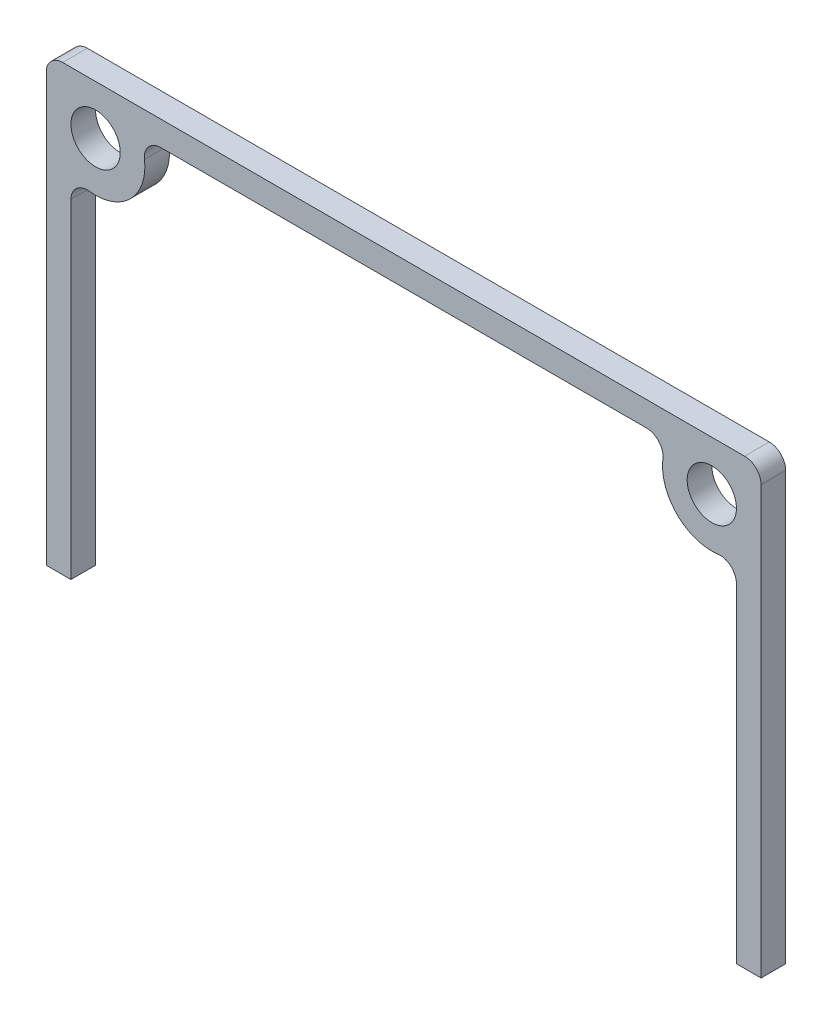
ISO-10303-21;
HEADER;
FILE_DESCRIPTION(('STEP AP214'),'2;1');
FILE_NAME('part.step','',(''),(''),'','','');
FILE_SCHEMA(('AUTOMOTIVE_DESIGN { 1 0 10303 214 1 1 1 1 }'));
ENDSEC;
DATA;
#1=APPLICATION_CONTEXT('core data for automotive mechanical design processes');
#2=APPLICATION_PROTOCOL_DEFINITION('international standard','automotive_design',2000,#1);
#3=PRODUCT_CONTEXT('',#1,'mechanical');
#4=PRODUCT('Part','Part','',(#3));
#5=PRODUCT_RELATED_PRODUCT_CATEGORY('part','',(#4));
#6=PRODUCT_DEFINITION_FORMATION('','',#4);
#7=PRODUCT_DEFINITION_CONTEXT('part definition',#1,'design');
#8=PRODUCT_DEFINITION('design','',#6,#7);
#9=PRODUCT_DEFINITION_SHAPE('','',#8);
#10=(LENGTH_UNIT() NAMED_UNIT(*) SI_UNIT(.MILLI.,.METRE.));
#11=(NAMED_UNIT(*) PLANE_ANGLE_UNIT() SI_UNIT($,.RADIAN.));
#12=(NAMED_UNIT(*) SI_UNIT($,.STERADIAN.) SOLID_ANGLE_UNIT());
#13=UNCERTAINTY_MEASURE_WITH_UNIT(LENGTH_MEASURE(1.E-05),#10,'distance_accuracy_value','');
#14=(GEOMETRIC_REPRESENTATION_CONTEXT(3) GLOBAL_UNCERTAINTY_ASSIGNED_CONTEXT((#13)) GLOBAL_UNIT_ASSIGNED_CONTEXT((#10,
#11,#12)) REPRESENTATION_CONTEXT('',''));
#15=CARTESIAN_POINT('',(0.,0.,0.));
#16=DIRECTION('',(0.,0.,1.));
#17=DIRECTION('',(1.,0.,0.));
#18=AXIS2_PLACEMENT_3D('',#15,#16,#17);
#19=CARTESIAN_POINT('',(244.475,254.39843752422,19.05));
#20=DIRECTION('',(0.,0.,1.));
#21=DIRECTION('',(1.,0.,0.));
#22=AXIS2_PLACEMENT_3D('',#19,#20,#21);
#23=PLANE('',#22);
#24=CARTESIAN_POINT('',(238.125,304.8,19.05));
#25=DIRECTION('',(0.,0.,1.));
#26=DIRECTION('',(1.,0.,0.));
#27=AXIS2_PLACEMENT_3D('',#24,#25,#26);
#28=CIRCLE('',#27,19.05);
#29=CARTESIAN_POINT('',(219.075,304.8,19.05));
#30=VERTEX_POINT('',#29);
#31=EDGE_CURVE('E183',#30,#30,#28,.T.);
#32=ORIENTED_EDGE('',*,*,#31,.F.);
#33=EDGE_LOOP('',(#32));
#34=FACE_BOUND('',#33,.T.);
#35=DIRECTION('',(1.,0.,0.));
#36=VECTOR('',#35,1.);
#37=CARTESIAN_POINT('',(276.225,0.,19.05));
#38=LINE('',#37,#36);
#39=CARTESIAN_POINT('',(257.175,0.,19.05));
#40=VERTEX_POINT('',#39);
#41=CARTESIAN_POINT('',(276.225,0.,19.05));
#42=VERTEX_POINT('',#41);
#43=EDGE_CURVE('E212',#40,#42,#38,.T.);
#44=ORIENTED_EDGE('',*,*,#43,.T.);
#45=DIRECTION('',(0.,1.,0.));
#46=VECTOR('',#45,1.);
#47=CARTESIAN_POINT('',(276.225,0.,19.05));
#48=LINE('',#47,#46);
#49=CARTESIAN_POINT('',(276.225,330.2,19.05));
#50=VERTEX_POINT('',#49);
#51=EDGE_CURVE('E115',#42,#50,#48,.T.);
#52=ORIENTED_EDGE('',*,*,#51,.T.);
#53=CARTESIAN_POINT('',(263.525,330.2,19.05));
#54=DIRECTION('',(0.,0.,1.));
#55=DIRECTION('',(-1.,0.,0.));
#56=AXIS2_PLACEMENT_3D('',#53,#54,#55);
#57=CIRCLE('',#56,12.7);
#58=CARTESIAN_POINT('',(263.525,342.9,19.05));
#59=VERTEX_POINT('',#58);
#60=EDGE_CURVE('E251',#50,#59,#57,.T.);
#61=ORIENTED_EDGE('',*,*,#60,.T.);
#62=DIRECTION('',(-1.,0.,0.));
#63=VECTOR('',#62,1.);
#64=CARTESIAN_POINT('',(263.525,342.9,19.05));
#65=LINE('',#64,#63);
#66=CARTESIAN_POINT('',(-263.525,342.9,19.05));
#67=VERTEX_POINT('',#66);
#68=EDGE_CURVE('E268',#59,#67,#65,.T.);
#69=ORIENTED_EDGE('',*,*,#68,.T.);
#70=CARTESIAN_POINT('',(-263.525,330.2,19.05));
#71=DIRECTION('',(0.,0.,1.));
#72=DIRECTION('',(1.,0.,0.));
#73=AXIS2_PLACEMENT_3D('',#70,#71,#72);
#74=CIRCLE('',#73,12.7);
#75=CARTESIAN_POINT('',(-276.225,330.2,19.05));
#76=VERTEX_POINT('',#75);
#77=EDGE_CURVE('E265',#67,#76,#74,.T.);
#78=ORIENTED_EDGE('',*,*,#77,.T.);
#79=DIRECTION('',(0.,-1.,0.));
#80=VECTOR('',#79,1.);
#81=CARTESIAN_POINT('',(-276.225,0.,19.05));
#82=LINE('',#81,#80);
#83=CARTESIAN_POINT('',(-276.225,0.,19.05));
#84=VERTEX_POINT('',#83);
#85=EDGE_CURVE('E267',#76,#84,#82,.T.);
#86=ORIENTED_EDGE('',*,*,#85,.T.);
#87=DIRECTION('',(1.,0.,0.));
#88=VECTOR('',#87,1.);
#89=CARTESIAN_POINT('',(-276.225,0.,19.05));
#90=LINE('',#89,#88);
#91=CARTESIAN_POINT('',(-257.175,0.,19.05));
#92=VERTEX_POINT('',#91);
#93=EDGE_CURVE('E270',#84,#92,#90,.T.);
#94=ORIENTED_EDGE('',*,*,#93,.T.);
#95=DIRECTION('',(0.,1.,0.));
#96=VECTOR('',#95,1.);
#97=CARTESIAN_POINT('',(-257.175,0.,19.05));
#98=LINE('',#97,#96);
#99=CARTESIAN_POINT('',(-257.175,254.39843752422,19.05));
#100=VERTEX_POINT('',#99);
#101=EDGE_CURVE('E276',#92,#100,#98,.T.);
#102=ORIENTED_EDGE('',*,*,#101,.T.);
#103=CARTESIAN_POINT('',(-244.475,254.39843752422,19.05));
#104=DIRECTION('',(0.,0.,-1.));
#105=DIRECTION('',(-1.,0.,0.));
#106=AXIS2_PLACEMENT_3D('',#103,#104,#105);
#107=CIRCLE('',#106,12.7);
#108=CARTESIAN_POINT('',(-242.8875,266.998828143165,19.05));
#109=VERTEX_POINT('',#108);
#110=EDGE_CURVE('E278',#100,#109,#107,.T.);
#111=ORIENTED_EDGE('',*,*,#110,.T.);
#112=CARTESIAN_POINT('',(-238.125,304.8,19.05));
#113=DIRECTION('',(0.,0.,1.));
#114=DIRECTION('',(1.,0.,0.));
#115=AXIS2_PLACEMENT_3D('',#112,#113,#114);
#116=CIRCLE('',#115,38.1);
#117=CARTESIAN_POINT('',(-200.323828143165,309.5625,19.05));
#118=VERTEX_POINT('',#117);
#119=EDGE_CURVE('E280',#109,#118,#116,.T.);
#120=ORIENTED_EDGE('',*,*,#119,.T.);
#121=CARTESIAN_POINT('',(-187.72343752422,311.15,19.05));
#122=DIRECTION('',(0.,0.,-1.));
#123=DIRECTION('',(1.,0.,0.));
#124=AXIS2_PLACEMENT_3D('',#121,#122,#123);
#125=CIRCLE('',#124,12.7);
#126=CARTESIAN_POINT('',(-187.72343752422,323.85,19.05));
#127=VERTEX_POINT('',#126);
#128=EDGE_CURVE('E282',#118,#127,#125,.T.);
#129=ORIENTED_EDGE('',*,*,#128,.T.);
#130=DIRECTION('',(1.,0.,0.));
#131=VECTOR('',#130,1.);
#132=CARTESIAN_POINT('',(187.72343752422,323.85,19.05));
#133=LINE('',#132,#131);
#134=CARTESIAN_POINT('',(187.72343752422,323.85,19.05));
#135=VERTEX_POINT('',#134);
#136=EDGE_CURVE('E284',#127,#135,#133,.T.);
#137=ORIENTED_EDGE('',*,*,#136,.T.);
#138=CARTESIAN_POINT('',(187.72343752422,311.15,19.05));
#139=DIRECTION('',(0.,0.,-1.));
#140=DIRECTION('',(-1.,0.,0.));
#141=AXIS2_PLACEMENT_3D('',#138,#139,#140);
#142=CIRCLE('',#141,12.7);
#143=CARTESIAN_POINT('',(200.323828143165,309.5625,19.05));
#144=VERTEX_POINT('',#143);
#145=EDGE_CURVE('E159',#135,#144,#142,.T.);
#146=ORIENTED_EDGE('',*,*,#145,.T.);
#147=CARTESIAN_POINT('',(238.125,304.8,19.05));
#148=DIRECTION('',(0.,0.,1.));
#149=DIRECTION('',(-1.,0.,0.));
#150=AXIS2_PLACEMENT_3D('',#147,#148,#149);
#151=CIRCLE('',#150,38.1);
#152=CARTESIAN_POINT('',(242.8875,266.998828143165,19.05));
#153=VERTEX_POINT('',#152);
#154=EDGE_CURVE('E152',#144,#153,#151,.T.);
#155=ORIENTED_EDGE('',*,*,#154,.T.);
#156=CARTESIAN_POINT('',(244.475,254.39843752422,19.05));
#157=DIRECTION('',(0.,0.,-1.));
#158=DIRECTION('',(1.,0.,0.));
#159=AXIS2_PLACEMENT_3D('',#156,#157,#158);
#160=CIRCLE('',#159,12.7);
#161=CARTESIAN_POINT('',(257.175,254.39843752422,19.05));
#162=VERTEX_POINT('',#161);
#163=EDGE_CURVE('E156',#153,#162,#160,.T.);
#164=ORIENTED_EDGE('',*,*,#163,.T.);
#165=DIRECTION('',(0.,-1.,0.));
#166=VECTOR('',#165,1.);
#167=CARTESIAN_POINT('',(257.175,165.1,19.05));
#168=LINE('',#167,#166);
#169=EDGE_CURVE('E50',#162,#40,#168,.T.);
#170=ORIENTED_EDGE('',*,*,#169,.T.);
#171=EDGE_LOOP('',(#44,#52,#61,#69,#78,#86,#94,#102,#111,#120,#129,#137,#146,#155,#164,#170));
#172=FACE_BOUND('',#171,.T.);
#173=CARTESIAN_POINT('',(-238.125,304.8,19.05));
#174=DIRECTION('',(0.,0.,1.));
#175=DIRECTION('',(-1.,0.,0.));
#176=AXIS2_PLACEMENT_3D('',#173,#174,#175);
#177=CIRCLE('',#176,19.05);
#178=CARTESIAN_POINT('',(-257.175,304.8,19.05));
#179=VERTEX_POINT('',#178);
#180=EDGE_CURVE('E305',#179,#179,#177,.T.);
#181=ORIENTED_EDGE('',*,*,#180,.F.);
#182=EDGE_LOOP('',(#181));
#183=FACE_BOUND('',#182,.T.);
#184=ADVANCED_FACE('F33',(#34,#172,#183),#23,.T.);
#185=CARTESIAN_POINT('',(244.475,254.39843752422,0.));
#186=DIRECTION('',(0.,0.,1.));
#187=DIRECTION('',(1.,0.,0.));
#188=AXIS2_PLACEMENT_3D('',#185,#186,#187);
#189=PLANE('',#188);
#190=DIRECTION('',(1.,0.,0.));
#191=VECTOR('',#190,1.);
#192=CARTESIAN_POINT('',(276.225,0.,0.));
#193=LINE('',#192,#191);
#194=CARTESIAN_POINT('',(257.175,0.,0.));
#195=VERTEX_POINT('',#194);
#196=CARTESIAN_POINT('',(276.225,0.,0.));
#197=VERTEX_POINT('',#196);
#198=EDGE_CURVE('E179',#195,#197,#193,.T.);
#199=ORIENTED_EDGE('',*,*,#198,.F.);
#200=DIRECTION('',(0.,-1.,0.));
#201=VECTOR('',#200,1.);
#202=CARTESIAN_POINT('',(257.175,0.,0.));
#203=LINE('',#202,#201);
#204=CARTESIAN_POINT('',(257.175,254.39843752422,0.));
#205=VERTEX_POINT('',#204);
#206=EDGE_CURVE('E103',#205,#195,#203,.T.);
#207=ORIENTED_EDGE('',*,*,#206,.F.);
#208=CARTESIAN_POINT('',(244.475,254.39843752422,0.));
#209=DIRECTION('',(0.,0.,-1.));
#210=DIRECTION('',(1.,0.,0.));
#211=AXIS2_PLACEMENT_3D('',#208,#209,#210);
#212=CIRCLE('',#211,12.7);
#213=CARTESIAN_POINT('',(242.8875,266.998828143165,0.));
#214=VERTEX_POINT('',#213);
#215=EDGE_CURVE('E209',#214,#205,#212,.T.);
#216=ORIENTED_EDGE('',*,*,#215,.F.);
#217=CARTESIAN_POINT('',(238.125,304.8,0.));
#218=DIRECTION('',(0.,0.,1.));
#219=DIRECTION('',(-1.,0.,0.));
#220=AXIS2_PLACEMENT_3D('',#217,#218,#219);
#221=CIRCLE('',#220,38.1);
#222=CARTESIAN_POINT('',(200.323828143165,309.5625,0.));
#223=VERTEX_POINT('',#222);
#224=EDGE_CURVE('E168',#223,#214,#221,.T.);
#225=ORIENTED_EDGE('',*,*,#224,.F.);
#226=CARTESIAN_POINT('',(187.72343752422,311.15,0.));
#227=DIRECTION('',(0.,0.,-1.));
#228=DIRECTION('',(-1.,0.,0.));
#229=AXIS2_PLACEMENT_3D('',#226,#227,#228);
#230=CIRCLE('',#229,12.7);
#231=CARTESIAN_POINT('',(187.72343752422,323.85,0.));
#232=VERTEX_POINT('',#231);
#233=EDGE_CURVE('E206',#232,#223,#230,.T.);
#234=ORIENTED_EDGE('',*,*,#233,.F.);
#235=DIRECTION('',(1.,0.,0.));
#236=VECTOR('',#235,1.);
#237=CARTESIAN_POINT('',(187.72343752422,323.85,0.));
#238=LINE('',#237,#236);
#239=CARTESIAN_POINT('',(-187.72343752422,323.85,0.));
#240=VERTEX_POINT('',#239);
#241=EDGE_CURVE('E204',#240,#232,#238,.T.);
#242=ORIENTED_EDGE('',*,*,#241,.F.);
#243=CARTESIAN_POINT('',(-187.72343752422,311.15,0.));
#244=DIRECTION('',(0.,0.,-1.));
#245=DIRECTION('',(1.,0.,0.));
#246=AXIS2_PLACEMENT_3D('',#243,#244,#245);
#247=CIRCLE('',#246,12.7);
#248=CARTESIAN_POINT('',(-200.323828143165,309.5625,0.));
#249=VERTEX_POINT('',#248);
#250=EDGE_CURVE('E202',#249,#240,#247,.T.);
#251=ORIENTED_EDGE('',*,*,#250,.F.);
#252=CARTESIAN_POINT('',(-238.125,304.8,0.));
#253=DIRECTION('',(0.,0.,1.));
#254=DIRECTION('',(1.,0.,0.));
#255=AXIS2_PLACEMENT_3D('',#252,#253,#254);
#256=CIRCLE('',#255,38.1);
#257=CARTESIAN_POINT('',(-242.8875,266.998828143165,0.));
#258=VERTEX_POINT('',#257);
#259=EDGE_CURVE('E200',#258,#249,#256,.T.);
#260=ORIENTED_EDGE('',*,*,#259,.F.);
#261=CARTESIAN_POINT('',(-244.475,254.39843752422,0.));
#262=DIRECTION('',(0.,0.,-1.));
#263=DIRECTION('',(-1.,0.,0.));
#264=AXIS2_PLACEMENT_3D('',#261,#262,#263);
#265=CIRCLE('',#264,12.7);
#266=CARTESIAN_POINT('',(-257.175,254.39843752422,0.));
#267=VERTEX_POINT('',#266);
#268=EDGE_CURVE('E198',#267,#258,#265,.T.);
#269=ORIENTED_EDGE('',*,*,#268,.F.);
#270=DIRECTION('',(0.,1.,0.));
#271=VECTOR('',#270,1.);
#272=CARTESIAN_POINT('',(-257.175,165.1,0.));
#273=LINE('',#272,#271);
#274=CARTESIAN_POINT('',(-257.175,0.,0.));
#275=VERTEX_POINT('',#274);
#276=EDGE_CURVE('E196',#275,#267,#273,.T.);
#277=ORIENTED_EDGE('',*,*,#276,.F.);
#278=DIRECTION('',(1.,0.,0.));
#279=VECTOR('',#278,1.);
#280=CARTESIAN_POINT('',(-276.225,0.,0.));
#281=LINE('',#280,#279);
#282=CARTESIAN_POINT('',(-276.225,0.,0.));
#283=VERTEX_POINT('',#282);
#284=EDGE_CURVE('E193',#283,#275,#281,.T.);
#285=ORIENTED_EDGE('',*,*,#284,.F.);
#286=DIRECTION('',(0.,-1.,0.));
#287=VECTOR('',#286,1.);
#288=CARTESIAN_POINT('',(-276.225,0.,0.));
#289=LINE('',#288,#287);
#290=CARTESIAN_POINT('',(-276.225,330.2,0.));
#291=VERTEX_POINT('',#290);
#292=EDGE_CURVE('E191',#291,#283,#289,.T.);
#293=ORIENTED_EDGE('',*,*,#292,.F.);
#294=CARTESIAN_POINT('',(-263.525,330.2,0.));
#295=DIRECTION('',(0.,0.,1.));
#296=DIRECTION('',(1.,0.,0.));
#297=AXIS2_PLACEMENT_3D('',#294,#295,#296);
#298=CIRCLE('',#297,12.7);
#299=CARTESIAN_POINT('',(-263.525,342.9,0.));
#300=VERTEX_POINT('',#299);
#301=EDGE_CURVE('E189',#300,#291,#298,.T.);
#302=ORIENTED_EDGE('',*,*,#301,.F.);
#303=DIRECTION('',(-1.,0.,0.));
#304=VECTOR('',#303,1.);
#305=CARTESIAN_POINT('',(263.525,342.9,0.));
#306=LINE('',#305,#304);
#307=CARTESIAN_POINT('',(263.525,342.9,0.));
#308=VERTEX_POINT('',#307);
#309=EDGE_CURVE('E187',#308,#300,#306,.T.);
#310=ORIENTED_EDGE('',*,*,#309,.F.);
#311=CARTESIAN_POINT('',(263.525,330.2,0.));
#312=DIRECTION('',(0.,0.,1.));
#313=DIRECTION('',(-1.,0.,0.));
#314=AXIS2_PLACEMENT_3D('',#311,#312,#313);
#315=CIRCLE('',#314,12.7);
#316=CARTESIAN_POINT('',(276.225,330.2,0.));
#317=VERTEX_POINT('',#316);
#318=EDGE_CURVE('E185',#317,#308,#315,.T.);
#319=ORIENTED_EDGE('',*,*,#318,.F.);
#320=DIRECTION('',(0.,1.,0.));
#321=VECTOR('',#320,1.);
#322=CARTESIAN_POINT('',(276.225,0.,0.));
#323=LINE('',#322,#321);
#324=EDGE_CURVE('E182',#197,#317,#323,.T.);
#325=ORIENTED_EDGE('',*,*,#324,.F.);
#326=EDGE_LOOP('',(#199,#207,#216,#225,#234,#242,#251,#260,#269,#277,#285,#293,#302,#310,#319,#325));
#327=FACE_BOUND('',#326,.T.);
#328=CARTESIAN_POINT('',(238.125,304.8,0.));
#329=DIRECTION('',(0.,0.,1.));
#330=DIRECTION('',(1.,0.,0.));
#331=AXIS2_PLACEMENT_3D('',#328,#329,#330);
#332=CIRCLE('',#331,19.05);
#333=CARTESIAN_POINT('',(219.075,304.8,0.));
#334=VERTEX_POINT('',#333);
#335=EDGE_CURVE('E302',#334,#334,#332,.T.);
#336=ORIENTED_EDGE('',*,*,#335,.T.);
#337=EDGE_LOOP('',(#336));
#338=FACE_BOUND('',#337,.T.);
#339=CARTESIAN_POINT('',(-238.125,304.8,0.));
#340=DIRECTION('',(0.,0.,1.));
#341=DIRECTION('',(-1.,0.,0.));
#342=AXIS2_PLACEMENT_3D('',#339,#340,#341);
#343=CIRCLE('',#342,19.05);
#344=CARTESIAN_POINT('',(-257.175,304.8,0.));
#345=VERTEX_POINT('',#344);
#346=EDGE_CURVE('E308',#345,#345,#343,.T.);
#347=ORIENTED_EDGE('',*,*,#346,.T.);
#348=EDGE_LOOP('',(#347));
#349=FACE_BOUND('',#348,.T.);
#350=ADVANCED_FACE('F253',(#327,#338,#349),#189,.F.);
#351=CARTESIAN_POINT('',(276.225,0.,19.05));
#352=DIRECTION('',(0.,1.,0.));
#353=DIRECTION('',(-1.,0.,0.));
#354=AXIS2_PLACEMENT_3D('',#351,#352,#353);
#355=PLANE('',#354);
#356=ORIENTED_EDGE('',*,*,#198,.T.);
#357=DIRECTION('',(0.,0.,-1.));
#358=VECTOR('',#357,1.);
#359=CARTESIAN_POINT('',(276.225,0.,19.05));
#360=LINE('',#359,#358);
#361=EDGE_CURVE('E11',#42,#197,#360,.T.);
#362=ORIENTED_EDGE('',*,*,#361,.F.);
#363=ORIENTED_EDGE('',*,*,#43,.F.);
#364=DIRECTION('',(0.,0.,-1.));
#365=VECTOR('',#364,1.);
#366=CARTESIAN_POINT('',(257.175,0.,19.05));
#367=LINE('',#366,#365);
#368=EDGE_CURVE('E175',#40,#195,#367,.T.);
#369=ORIENTED_EDGE('',*,*,#368,.T.);
#370=EDGE_LOOP('',(#356,#362,#363,#369));
#371=FACE_BOUND('',#370,.T.);
#372=ADVANCED_FACE('F35',(#371),#355,.F.);
#373=CARTESIAN_POINT('',(276.225,0.,19.05));
#374=DIRECTION('',(-1.,0.,0.));
#375=DIRECTION('',(0.,-1.,0.));
#376=AXIS2_PLACEMENT_3D('',#373,#374,#375);
#377=PLANE('',#376);
#378=ORIENTED_EDGE('',*,*,#324,.T.);
#379=DIRECTION('',(0.,0.,-1.));
#380=VECTOR('',#379,1.);
#381=CARTESIAN_POINT('',(276.225,330.2,19.05));
#382=LINE('',#381,#380);
#383=EDGE_CURVE('E42',#50,#317,#382,.T.);
#384=ORIENTED_EDGE('',*,*,#383,.F.);
#385=ORIENTED_EDGE('',*,*,#51,.F.);
#386=ORIENTED_EDGE('',*,*,#361,.T.);
#387=EDGE_LOOP('',(#378,#384,#385,#386));
#388=FACE_BOUND('',#387,.T.);
#389=ADVANCED_FACE('F367',(#388),#377,.F.);
#390=CARTESIAN_POINT('',(263.525,330.2,19.05));
#391=DIRECTION('',(0.,0.,-1.));
#392=DIRECTION('',(-1.,0.,0.));
#393=AXIS2_PLACEMENT_3D('',#390,#391,#392);
#394=CYLINDRICAL_SURFACE('',#393,12.7);
#395=ORIENTED_EDGE('',*,*,#318,.T.);
#396=DIRECTION('',(0.,0.,-1.));
#397=VECTOR('',#396,1.);
#398=CARTESIAN_POINT('',(263.525,342.9,19.05));
#399=LINE('',#398,#397);
#400=EDGE_CURVE('E243',#59,#308,#399,.T.);
#401=ORIENTED_EDGE('',*,*,#400,.F.);
#402=ORIENTED_EDGE('',*,*,#60,.F.);
#403=ORIENTED_EDGE('',*,*,#383,.T.);
#404=EDGE_LOOP('',(#395,#401,#402,#403));
#405=FACE_BOUND('',#404,.T.);
#406=ADVANCED_FACE('F249',(#405),#394,.T.);
#407=CARTESIAN_POINT('',(263.525,342.9,19.05));
#408=DIRECTION('',(0.,-1.,0.));
#409=DIRECTION('',(0.,0.,-1.));
#410=AXIS2_PLACEMENT_3D('',#407,#408,#409);
#411=PLANE('',#410);
#412=ORIENTED_EDGE('',*,*,#309,.T.);
#413=DIRECTION('',(0.,0.,-1.));
#414=VECTOR('',#413,1.);
#415=CARTESIAN_POINT('',(-263.525,342.9,19.05));
#416=LINE('',#415,#414);
#417=EDGE_CURVE('E240',#67,#300,#416,.T.);
#418=ORIENTED_EDGE('',*,*,#417,.F.);
#419=ORIENTED_EDGE('',*,*,#68,.F.);
#420=ORIENTED_EDGE('',*,*,#400,.T.);
#421=EDGE_LOOP('',(#412,#418,#419,#420));
#422=FACE_BOUND('',#421,.T.);
#423=ADVANCED_FACE('F259',(#422),#411,.F.);
#424=CARTESIAN_POINT('',(-263.525,330.2,19.05));
#425=DIRECTION('',(0.,0.,-1.));
#426=DIRECTION('',(-1.,0.,0.));
#427=AXIS2_PLACEMENT_3D('',#424,#425,#426);
#428=CYLINDRICAL_SURFACE('',#427,12.7);
#429=ORIENTED_EDGE('',*,*,#301,.T.);
#430=DIRECTION('',(0.,0.,-1.));
#431=VECTOR('',#430,1.);
#432=CARTESIAN_POINT('',(-276.225,330.2,19.05));
#433=LINE('',#432,#431);
#434=EDGE_CURVE('E237',#76,#291,#433,.T.);
#435=ORIENTED_EDGE('',*,*,#434,.F.);
#436=ORIENTED_EDGE('',*,*,#77,.F.);
#437=ORIENTED_EDGE('',*,*,#417,.T.);
#438=EDGE_LOOP('',(#429,#435,#436,#437));
#439=FACE_BOUND('',#438,.T.);
#440=ADVANCED_FACE('F263',(#439),#428,.T.);
#441=CARTESIAN_POINT('',(-276.225,0.,19.05));
#442=DIRECTION('',(1.,0.,0.));
#443=DIRECTION('',(0.,1.,0.));
#444=AXIS2_PLACEMENT_3D('',#441,#442,#443);
#445=PLANE('',#444);
#446=ORIENTED_EDGE('',*,*,#292,.T.);
#447=DIRECTION('',(0.,0.,-1.));
#448=VECTOR('',#447,1.);
#449=CARTESIAN_POINT('',(-276.225,0.,19.05));
#450=LINE('',#449,#448);
#451=EDGE_CURVE('E234',#84,#283,#450,.T.);
#452=ORIENTED_EDGE('',*,*,#451,.F.);
#453=ORIENTED_EDGE('',*,*,#85,.F.);
#454=ORIENTED_EDGE('',*,*,#434,.T.);
#455=EDGE_LOOP('',(#446,#452,#453,#454));
#456=FACE_BOUND('',#455,.T.);
#457=ADVANCED_FACE('F357',(#456),#445,.F.);
#458=CARTESIAN_POINT('',(-276.225,0.,19.05));
#459=DIRECTION('',(0.,1.,0.));
#460=DIRECTION('',(-1.,0.,0.));
#461=AXIS2_PLACEMENT_3D('',#458,#459,#460);
#462=PLANE('',#461);
#463=ORIENTED_EDGE('',*,*,#284,.T.);
#464=DIRECTION('',(0.,0.,-1.));
#465=VECTOR('',#464,1.);
#466=CARTESIAN_POINT('',(-257.175,0.,19.05));
#467=LINE('',#466,#465);
#468=EDGE_CURVE('E231',#92,#275,#467,.T.);
#469=ORIENTED_EDGE('',*,*,#468,.F.);
#470=ORIENTED_EDGE('',*,*,#93,.F.);
#471=ORIENTED_EDGE('',*,*,#451,.T.);
#472=EDGE_LOOP('',(#463,#469,#470,#471));
#473=FACE_BOUND('',#472,.T.);
#474=ADVANCED_FACE('F353',(#473),#462,.F.);
#475=CARTESIAN_POINT('',(-257.175,165.1,19.05));
#476=DIRECTION('',(-1.,0.,0.));
#477=DIRECTION('',(0.,0.,1.));
#478=AXIS2_PLACEMENT_3D('',#475,#476,#477);
#479=PLANE('',#478);
#480=ORIENTED_EDGE('',*,*,#276,.T.);
#481=DIRECTION('',(0.,0.,-1.));
#482=VECTOR('',#481,1.);
#483=CARTESIAN_POINT('',(-257.175,254.39843752422,19.05));
#484=LINE('',#483,#482);
#485=EDGE_CURVE('E228',#100,#267,#484,.T.);
#486=ORIENTED_EDGE('',*,*,#485,.F.);
#487=ORIENTED_EDGE('',*,*,#101,.F.);
#488=ORIENTED_EDGE('',*,*,#468,.T.);
#489=EDGE_LOOP('',(#480,#486,#487,#488));
#490=FACE_BOUND('',#489,.T.);
#491=ADVANCED_FACE('F349',(#490),#479,.F.);
#492=CARTESIAN_POINT('',(-244.475,254.39843752422,19.05));
#493=DIRECTION('',(0.,0.,-1.));
#494=DIRECTION('',(-1.,0.,0.));
#495=AXIS2_PLACEMENT_3D('',#492,#493,#494);
#496=CYLINDRICAL_SURFACE('',#495,12.7);
#497=ORIENTED_EDGE('',*,*,#268,.T.);
#498=DIRECTION('',(0.,0.,-1.));
#499=VECTOR('',#498,1.);
#500=CARTESIAN_POINT('',(-242.8875,266.998828143165,19.05));
#501=LINE('',#500,#499);
#502=EDGE_CURVE('E225',#109,#258,#501,.T.);
#503=ORIENTED_EDGE('',*,*,#502,.F.);
#504=ORIENTED_EDGE('',*,*,#110,.F.);
#505=ORIENTED_EDGE('',*,*,#485,.T.);
#506=EDGE_LOOP('',(#497,#503,#504,#505));
#507=FACE_BOUND('',#506,.T.);
#508=ADVANCED_FACE('F345',(#507),#496,.F.);
#509=CARTESIAN_POINT('',(-238.125,304.8,19.05));
#510=DIRECTION('',(0.,0.,-1.));
#511=DIRECTION('',(-1.,0.,0.));
#512=AXIS2_PLACEMENT_3D('',#509,#510,#511);
#513=CYLINDRICAL_SURFACE('',#512,38.1);
#514=ORIENTED_EDGE('',*,*,#259,.T.);
#515=DIRECTION('',(0.,0.,-1.));
#516=VECTOR('',#515,1.);
#517=CARTESIAN_POINT('',(-200.323828143165,309.5625,19.05));
#518=LINE('',#517,#516);
#519=EDGE_CURVE('E222',#118,#249,#518,.T.);
#520=ORIENTED_EDGE('',*,*,#519,.F.);
#521=ORIENTED_EDGE('',*,*,#119,.F.);
#522=ORIENTED_EDGE('',*,*,#502,.T.);
#523=EDGE_LOOP('',(#514,#520,#521,#522));
#524=FACE_BOUND('',#523,.T.);
#525=ADVANCED_FACE('F341',(#524),#513,.T.);
#526=CARTESIAN_POINT('',(-187.72343752422,311.15,19.05));
#527=DIRECTION('',(0.,0.,-1.));
#528=DIRECTION('',(-1.,0.,0.));
#529=AXIS2_PLACEMENT_3D('',#526,#527,#528);
#530=CYLINDRICAL_SURFACE('',#529,12.7);
#531=ORIENTED_EDGE('',*,*,#250,.T.);
#532=DIRECTION('',(0.,0.,-1.));
#533=VECTOR('',#532,1.);
#534=CARTESIAN_POINT('',(-187.72343752422,323.85,19.05));
#535=LINE('',#534,#533);
#536=EDGE_CURVE('E219',#127,#240,#535,.T.);
#537=ORIENTED_EDGE('',*,*,#536,.F.);
#538=ORIENTED_EDGE('',*,*,#128,.F.);
#539=ORIENTED_EDGE('',*,*,#519,.T.);
#540=EDGE_LOOP('',(#531,#537,#538,#539));
#541=FACE_BOUND('',#540,.T.);
#542=ADVANCED_FACE('F338',(#541),#530,.F.);
#543=CARTESIAN_POINT('',(187.72343752422,323.85,19.05));
#544=DIRECTION('',(0.,1.,0.));
#545=DIRECTION('',(-1.,0.,0.));
#546=AXIS2_PLACEMENT_3D('',#543,#544,#545);
#547=PLANE('',#546);
#548=ORIENTED_EDGE('',*,*,#241,.T.);
#549=DIRECTION('',(0.,0.,-1.));
#550=VECTOR('',#549,1.);
#551=CARTESIAN_POINT('',(187.72343752422,323.85,19.05));
#552=LINE('',#551,#550);
#553=EDGE_CURVE('E216',#135,#232,#552,.T.);
#554=ORIENTED_EDGE('',*,*,#553,.F.);
#555=ORIENTED_EDGE('',*,*,#136,.F.);
#556=ORIENTED_EDGE('',*,*,#536,.T.);
#557=EDGE_LOOP('',(#548,#554,#555,#556));
#558=FACE_BOUND('',#557,.T.);
#559=ADVANCED_FACE('F290',(#558),#547,.F.);
#560=CARTESIAN_POINT('',(187.72343752422,311.15,19.05));
#561=DIRECTION('',(0.,0.,-1.));
#562=DIRECTION('',(-1.,0.,0.));
#563=AXIS2_PLACEMENT_3D('',#560,#561,#562);
#564=CYLINDRICAL_SURFACE('',#563,12.7);
#565=ORIENTED_EDGE('',*,*,#233,.T.);
#566=DIRECTION('',(0.,0.,-1.));
#567=VECTOR('',#566,1.);
#568=CARTESIAN_POINT('',(200.323828143165,309.5625,19.05));
#569=LINE('',#568,#567);
#570=EDGE_CURVE('E170',#144,#223,#569,.T.);
#571=ORIENTED_EDGE('',*,*,#570,.F.);
#572=ORIENTED_EDGE('',*,*,#145,.F.);
#573=ORIENTED_EDGE('',*,*,#553,.T.);
#574=EDGE_LOOP('',(#565,#571,#572,#573));
#575=FACE_BOUND('',#574,.T.);
#576=ADVANCED_FACE('F294',(#575),#564,.F.);
#577=CARTESIAN_POINT('',(238.125,304.8,19.05));
#578=DIRECTION('',(0.,0.,-1.));
#579=DIRECTION('',(-1.,0.,0.));
#580=AXIS2_PLACEMENT_3D('',#577,#578,#579);
#581=CYLINDRICAL_SURFACE('',#580,38.1);
#582=ORIENTED_EDGE('',*,*,#224,.T.);
#583=DIRECTION('',(0.,0.,-1.));
#584=VECTOR('',#583,1.);
#585=CARTESIAN_POINT('',(242.8875,266.998828143165,19.05));
#586=LINE('',#585,#584);
#587=EDGE_CURVE('E165',#153,#214,#586,.T.);
#588=ORIENTED_EDGE('',*,*,#587,.F.);
#589=ORIENTED_EDGE('',*,*,#154,.F.);
#590=ORIENTED_EDGE('',*,*,#570,.T.);
#591=EDGE_LOOP('',(#582,#588,#589,#590));
#592=FACE_BOUND('',#591,.T.);
#593=ADVANCED_FACE('F166',(#592),#581,.T.);
#594=CARTESIAN_POINT('',(244.475,254.39843752422,19.05));
#595=DIRECTION('',(0.,0.,-1.));
#596=DIRECTION('',(-1.,0.,0.));
#597=AXIS2_PLACEMENT_3D('',#594,#595,#596);
#598=CYLINDRICAL_SURFACE('',#597,12.7);
#599=ORIENTED_EDGE('',*,*,#215,.T.);
#600=DIRECTION('',(0.,0.,-1.));
#601=VECTOR('',#600,1.);
#602=CARTESIAN_POINT('',(257.175,254.39843752422,19.05));
#603=LINE('',#602,#601);
#604=EDGE_CURVE('E171',#162,#205,#603,.T.);
#605=ORIENTED_EDGE('',*,*,#604,.F.);
#606=ORIENTED_EDGE('',*,*,#163,.F.);
#607=ORIENTED_EDGE('',*,*,#587,.T.);
#608=EDGE_LOOP('',(#599,#605,#606,#607));
#609=FACE_BOUND('',#608,.T.);
#610=ADVANCED_FACE('F173',(#609),#598,.F.);
#611=CARTESIAN_POINT('',(257.175,0.,19.05));
#612=DIRECTION('',(1.,0.,0.));
#613=DIRECTION('',(0.,0.,-1.));
#614=AXIS2_PLACEMENT_3D('',#611,#612,#613);
#615=PLANE('',#614);
#616=ORIENTED_EDGE('',*,*,#206,.T.);
#617=ORIENTED_EDGE('',*,*,#368,.F.);
#618=ORIENTED_EDGE('',*,*,#169,.F.);
#619=ORIENTED_EDGE('',*,*,#604,.T.);
#620=EDGE_LOOP('',(#616,#617,#618,#619));
#621=FACE_BOUND('',#620,.T.);
#622=ADVANCED_FACE('F295',(#621),#615,.F.);
#623=CARTESIAN_POINT('',(238.125,304.8,19.05));
#624=DIRECTION('',(0.,0.,-1.));
#625=DIRECTION('',(-1.,0.,0.));
#626=AXIS2_PLACEMENT_3D('',#623,#624,#625);
#627=CYLINDRICAL_SURFACE('',#626,19.05);
#628=CARTESIAN_POINT('',(219.075,304.8,19.05));
#629=CARTESIAN_POINT('',(219.075,304.8,18.8515625));
#630=CARTESIAN_POINT('',(219.075,304.8,18.653125));
#631=CARTESIAN_POINT('',(219.075,304.8,18.25625));
#632=CARTESIAN_POINT('',(219.075,304.8,18.0578125));
#633=CARTESIAN_POINT('',(219.075,304.8,17.6609375));
#634=CARTESIAN_POINT('',(219.075,304.8,17.4625));
#635=CARTESIAN_POINT('',(219.075,304.8,17.065625));
#636=CARTESIAN_POINT('',(219.075,304.8,16.8671875));
#637=CARTESIAN_POINT('',(219.075,304.8,16.4703125));
#638=CARTESIAN_POINT('',(219.075,304.8,16.271875));
#639=CARTESIAN_POINT('',(219.075,304.8,15.875));
#640=CARTESIAN_POINT('',(219.075,304.8,15.6765625));
#641=CARTESIAN_POINT('',(219.075,304.8,15.2796875));
#642=CARTESIAN_POINT('',(219.075,304.8,15.08125));
#643=CARTESIAN_POINT('',(219.075,304.8,14.684375));
#644=CARTESIAN_POINT('',(219.075,304.8,14.4859375));
#645=CARTESIAN_POINT('',(219.075,304.8,14.0890625));
#646=CARTESIAN_POINT('',(219.075,304.8,13.890625));
#647=CARTESIAN_POINT('',(219.075,304.8,13.49375));
#648=CARTESIAN_POINT('',(219.075,304.8,13.2953125));
#649=CARTESIAN_POINT('',(219.075,304.8,12.8984375));
#650=CARTESIAN_POINT('',(219.075,304.8,12.7));
#651=CARTESIAN_POINT('',(219.075,304.8,12.303125));
#652=CARTESIAN_POINT('',(219.075,304.8,12.1046875));
#653=CARTESIAN_POINT('',(219.075,304.8,11.7078125));
#654=CARTESIAN_POINT('',(219.075,304.8,11.509375));
#655=CARTESIAN_POINT('',(219.075,304.8,11.1125));
#656=CARTESIAN_POINT('',(219.075,304.8,10.9140625));
#657=CARTESIAN_POINT('',(219.075,304.8,10.5171875));
#658=CARTESIAN_POINT('',(219.075,304.8,10.31875));
#659=CARTESIAN_POINT('',(219.075,304.8,9.921875));
#660=CARTESIAN_POINT('',(219.075,304.8,9.7234375));
#661=CARTESIAN_POINT('',(219.075,304.8,9.3265625));
#662=CARTESIAN_POINT('',(219.075,304.8,9.128125));
#663=CARTESIAN_POINT('',(219.075,304.8,8.73125));
#664=CARTESIAN_POINT('',(219.075,304.8,8.5328125));
#665=CARTESIAN_POINT('',(219.075,304.8,8.1359375));
#666=CARTESIAN_POINT('',(219.075,304.8,7.9375));
#667=CARTESIAN_POINT('',(219.075,304.8,7.540625));
#668=CARTESIAN_POINT('',(219.075,304.8,7.3421875));
#669=CARTESIAN_POINT('',(219.075,304.8,6.9453125));
#670=CARTESIAN_POINT('',(219.075,304.8,6.746875));
#671=CARTESIAN_POINT('',(219.075,304.8,6.35));
#672=CARTESIAN_POINT('',(219.075,304.8,6.1515625));
#673=CARTESIAN_POINT('',(219.075,304.8,5.7546875));
#674=CARTESIAN_POINT('',(219.075,304.8,5.55625));
#675=CARTESIAN_POINT('',(219.075,304.8,5.159375));
#676=CARTESIAN_POINT('',(219.075,304.8,4.9609375));
#677=CARTESIAN_POINT('',(219.075,304.8,4.5640625));
#678=CARTESIAN_POINT('',(219.075,304.8,4.365625));
#679=CARTESIAN_POINT('',(219.075,304.8,3.96875));
#680=CARTESIAN_POINT('',(219.075,304.8,3.7703125));
#681=CARTESIAN_POINT('',(219.075,304.8,3.3734375));
#682=CARTESIAN_POINT('',(219.075,304.8,3.175));
#683=CARTESIAN_POINT('',(219.075,304.8,2.778125));
#684=CARTESIAN_POINT('',(219.075,304.8,2.5796875));
#685=CARTESIAN_POINT('',(219.075,304.8,2.1828125));
#686=CARTESIAN_POINT('',(219.075,304.8,1.984375));
#687=CARTESIAN_POINT('',(219.075,304.8,1.5875));
#688=CARTESIAN_POINT('',(219.075,304.8,1.3890625));
#689=CARTESIAN_POINT('',(219.075,304.8,0.992187500000001));
#690=CARTESIAN_POINT('',(219.075,304.8,0.793750000000001));
#691=CARTESIAN_POINT('',(219.075,304.8,0.396875));
#692=CARTESIAN_POINT('',(219.075,304.8,0.1984375));
#693=CARTESIAN_POINT('',(219.075,304.8,0.));
#694=B_SPLINE_CURVE_WITH_KNOTS('',3,(#628,#629,#630,#631,#632,#633,#634,#635,#636,#637,#638,
#639,#640,#641,#642,#643,#644,#645,#646,#647,#648,#649,#650,#651,#652,#653,#654,#655,#656,#657,
#658,#659,#660,#661,#662,#663,#664,#665,#666,#667,#668,#669,#670,#671,#672,#673,#674,#675,#676,
#677,#678,#679,#680,#681,#682,#683,#684,#685,#686,#687,#688,#689,#690,#691,#692,#693),
.UNSPECIFIED.,.F.,.F.,(4,2,2,2,2,2,2,2,2,2,2,2,2,2,2,2,2,2,2,2,2,2,2,2,2,2,2,2,2,2,2,2,4),(0.,
0.5953125,1.190625,1.7859375,2.38125,2.9765625,3.571875,4.1671875,4.7625,5.3578125,5.953125,
6.5484375,7.14375,7.7390625,8.334375,8.9296875,9.525,10.1203125,10.715625,11.3109375,11.90625,
12.5015625,13.096875,13.6921875,14.2875,14.8828125,15.478125,16.0734375,16.66875,17.2640625,
17.859375,18.4546875,19.05),.UNSPECIFIED.);
#695=EDGE_CURVE('BSEAM325',#30,#334,#694,.T.);
#696=ORIENTED_EDGE('',*,*,#31,.T.);
#697=ORIENTED_EDGE('',*,*,#335,.F.);
#698=ORIENTED_EDGE('',*,*,#695,.T.);
#699=ORIENTED_EDGE('',*,*,#695,.F.);
#700=EDGE_LOOP('',(#696,#698,#697,#699));
#701=FACE_BOUND('',#700,.T.);
#702=ADVANCED_FACE('F325',(#701),#627,.F.);
#703=CARTESIAN_POINT('',(-238.125,304.8,19.05));
#704=DIRECTION('',(0.,0.,-1.));
#705=DIRECTION('',(-1.,0.,0.));
#706=AXIS2_PLACEMENT_3D('',#703,#704,#705);
#707=CYLINDRICAL_SURFACE('',#706,19.05);
#708=CARTESIAN_POINT('',(-257.175,304.8,19.05));
#709=CARTESIAN_POINT('',(-257.175,304.8,18.8515625));
#710=CARTESIAN_POINT('',(-257.175,304.8,18.653125));
#711=CARTESIAN_POINT('',(-257.175,304.8,18.25625));
#712=CARTESIAN_POINT('',(-257.175,304.8,18.0578125));
#713=CARTESIAN_POINT('',(-257.175,304.8,17.6609375));
#714=CARTESIAN_POINT('',(-257.175,304.8,17.4625));
#715=CARTESIAN_POINT('',(-257.175,304.8,17.065625));
#716=CARTESIAN_POINT('',(-257.175,304.8,16.8671875));
#717=CARTESIAN_POINT('',(-257.175,304.8,16.4703125));
#718=CARTESIAN_POINT('',(-257.175,304.8,16.271875));
#719=CARTESIAN_POINT('',(-257.175,304.8,15.875));
#720=CARTESIAN_POINT('',(-257.175,304.8,15.6765625));
#721=CARTESIAN_POINT('',(-257.175,304.8,15.2796875));
#722=CARTESIAN_POINT('',(-257.175,304.8,15.08125));
#723=CARTESIAN_POINT('',(-257.175,304.8,14.684375));
#724=CARTESIAN_POINT('',(-257.175,304.8,14.4859375));
#725=CARTESIAN_POINT('',(-257.175,304.8,14.0890625));
#726=CARTESIAN_POINT('',(-257.175,304.8,13.890625));
#727=CARTESIAN_POINT('',(-257.175,304.8,13.49375));
#728=CARTESIAN_POINT('',(-257.175,304.8,13.2953125));
#729=CARTESIAN_POINT('',(-257.175,304.8,12.8984375));
#730=CARTESIAN_POINT('',(-257.175,304.8,12.7));
#731=CARTESIAN_POINT('',(-257.175,304.8,12.303125));
#732=CARTESIAN_POINT('',(-257.175,304.8,12.1046875));
#733=CARTESIAN_POINT('',(-257.175,304.8,11.7078125));
#734=CARTESIAN_POINT('',(-257.175,304.8,11.509375));
#735=CARTESIAN_POINT('',(-257.175,304.8,11.1125));
#736=CARTESIAN_POINT('',(-257.175,304.8,10.9140625));
#737=CARTESIAN_POINT('',(-257.175,304.8,10.5171875));
#738=CARTESIAN_POINT('',(-257.175,304.8,10.31875));
#739=CARTESIAN_POINT('',(-257.175,304.8,9.921875));
#740=CARTESIAN_POINT('',(-257.175,304.8,9.7234375));
#741=CARTESIAN_POINT('',(-257.175,304.8,9.3265625));
#742=CARTESIAN_POINT('',(-257.175,304.8,9.128125));
#743=CARTESIAN_POINT('',(-257.175,304.8,8.73125));
#744=CARTESIAN_POINT('',(-257.175,304.8,8.5328125));
#745=CARTESIAN_POINT('',(-257.175,304.8,8.1359375));
#746=CARTESIAN_POINT('',(-257.175,304.8,7.9375));
#747=CARTESIAN_POINT('',(-257.175,304.8,7.540625));
#748=CARTESIAN_POINT('',(-257.175,304.8,7.3421875));
#749=CARTESIAN_POINT('',(-257.175,304.8,6.9453125));
#750=CARTESIAN_POINT('',(-257.175,304.8,6.746875));
#751=CARTESIAN_POINT('',(-257.175,304.8,6.35));
#752=CARTESIAN_POINT('',(-257.175,304.8,6.1515625));
#753=CARTESIAN_POINT('',(-257.175,304.8,5.7546875));
#754=CARTESIAN_POINT('',(-257.175,304.8,5.55625));
#755=CARTESIAN_POINT('',(-257.175,304.8,5.159375));
#756=CARTESIAN_POINT('',(-257.175,304.8,4.9609375));
#757=CARTESIAN_POINT('',(-257.175,304.8,4.5640625));
#758=CARTESIAN_POINT('',(-257.175,304.8,4.365625));
#759=CARTESIAN_POINT('',(-257.175,304.8,3.96875));
#760=CARTESIAN_POINT('',(-257.175,304.8,3.7703125));
#761=CARTESIAN_POINT('',(-257.175,304.8,3.3734375));
#762=CARTESIAN_POINT('',(-257.175,304.8,3.175));
#763=CARTESIAN_POINT('',(-257.175,304.8,2.778125));
#764=CARTESIAN_POINT('',(-257.175,304.8,2.5796875));
#765=CARTESIAN_POINT('',(-257.175,304.8,2.1828125));
#766=CARTESIAN_POINT('',(-257.175,304.8,1.984375));
#767=CARTESIAN_POINT('',(-257.175,304.8,1.5875));
#768=CARTESIAN_POINT('',(-257.175,304.8,1.3890625));
#769=CARTESIAN_POINT('',(-257.175,304.8,0.992187500000001));
#770=CARTESIAN_POINT('',(-257.175,304.8,0.793750000000001));
#771=CARTESIAN_POINT('',(-257.175,304.8,0.396875));
#772=CARTESIAN_POINT('',(-257.175,304.8,0.1984375));
#773=CARTESIAN_POINT('',(-257.175,304.8,0.));
#774=B_SPLINE_CURVE_WITH_KNOTS('',3,(#708,#709,#710,#711,#712,#713,#714,#715,#716,#717,#718,
#719,#720,#721,#722,#723,#724,#725,#726,#727,#728,#729,#730,#731,#732,#733,#734,#735,#736,#737,
#738,#739,#740,#741,#742,#743,#744,#745,#746,#747,#748,#749,#750,#751,#752,#753,#754,#755,#756,
#757,#758,#759,#760,#761,#762,#763,#764,#765,#766,#767,#768,#769,#770,#771,#772,#773),
.UNSPECIFIED.,.F.,.F.,(4,2,2,2,2,2,2,2,2,2,2,2,2,2,2,2,2,2,2,2,2,2,2,2,2,2,2,2,2,2,2,2,4),(0.,
0.5953125,1.190625,1.7859375,2.38125,2.9765625,3.571875,4.1671875,4.7625,5.3578125,5.953125,
6.5484375,7.14375,7.7390625,8.334375,8.9296875,9.525,10.1203125,10.715625,11.3109375,11.90625,
12.5015625,13.096875,13.6921875,14.2875,14.8828125,15.478125,16.0734375,16.66875,17.2640625,
17.859375,18.4546875,19.05),.UNSPECIFIED.);
#775=EDGE_CURVE('BSEAM314',#179,#345,#774,.T.);
#776=ORIENTED_EDGE('',*,*,#180,.T.);
#777=ORIENTED_EDGE('',*,*,#346,.F.);
#778=ORIENTED_EDGE('',*,*,#775,.T.);
#779=ORIENTED_EDGE('',*,*,#775,.F.);
#780=EDGE_LOOP('',(#776,#778,#777,#779));
#781=FACE_BOUND('',#780,.T.);
#782=ADVANCED_FACE('F314',(#781),#707,.F.);
#783=CLOSED_SHELL('',(#184,#350,#372,#389,#406,#423,#440,#457,#474,#491,#508,#525,#542,#559,
#576,#593,#610,#622,#702,#782));
#784=MANIFOLD_SOLID_BREP('B2',#783);
#785=ADVANCED_BREP_SHAPE_REPRESENTATION('',(#18,#784),#14);
#786=SHAPE_DEFINITION_REPRESENTATION(#9,#785);
ENDSEC;
END-ISO-10303-21;
